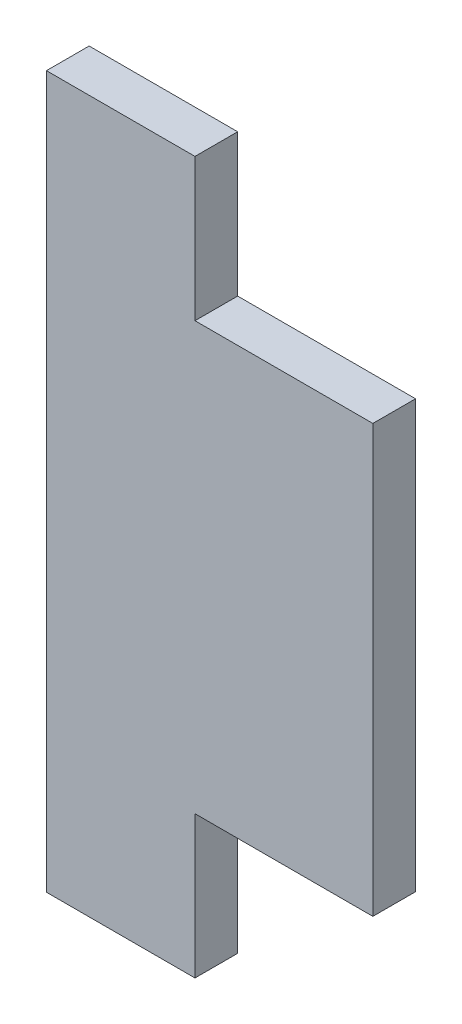
ISO-10303-21;
HEADER;
FILE_DESCRIPTION(('STEP AP214'),'2;1');
FILE_NAME('part.step','',(''),(''),'','','');
FILE_SCHEMA(('AUTOMOTIVE_DESIGN { 1 0 10303 214 1 1 1 1 }'));
ENDSEC;
DATA;
#1=APPLICATION_CONTEXT('core data for automotive mechanical design processes');
#2=APPLICATION_PROTOCOL_DEFINITION('international standard','automotive_design',2000,#1);
#3=PRODUCT_CONTEXT('',#1,'mechanical');
#4=PRODUCT('Part','Part','',(#3));
#5=PRODUCT_RELATED_PRODUCT_CATEGORY('part','',(#4));
#6=PRODUCT_DEFINITION_FORMATION('','',#4);
#7=PRODUCT_DEFINITION_CONTEXT('part definition',#1,'design');
#8=PRODUCT_DEFINITION('design','',#6,#7);
#9=PRODUCT_DEFINITION_SHAPE('','',#8);
#10=(LENGTH_UNIT() NAMED_UNIT(*) SI_UNIT(.MILLI.,.METRE.));
#11=(NAMED_UNIT(*) PLANE_ANGLE_UNIT() SI_UNIT($,.RADIAN.));
#12=(NAMED_UNIT(*) SI_UNIT($,.STERADIAN.) SOLID_ANGLE_UNIT());
#13=UNCERTAINTY_MEASURE_WITH_UNIT(LENGTH_MEASURE(1.E-05),#10,'distance_accuracy_value','');
#14=(GEOMETRIC_REPRESENTATION_CONTEXT(3) GLOBAL_UNCERTAINTY_ASSIGNED_CONTEXT((#13)) GLOBAL_UNIT_ASSIGNED_CONTEXT((#10,
#11,#12)) REPRESENTATION_CONTEXT('',''));
#15=CARTESIAN_POINT('',(0.,0.,0.));
#16=DIRECTION('',(0.,0.,1.));
#17=DIRECTION('',(1.,0.,0.));
#18=AXIS2_PLACEMENT_3D('',#15,#16,#17);
#19=CARTESIAN_POINT('',(0.104365376,-0.25,-0.03));
#20=DIRECTION('',(0.,0.,-1.));
#21=DIRECTION('',(-1.,0.,0.));
#22=AXIS2_PLACEMENT_3D('',#19,#20,#21);
#23=PLANE('',#22);
#24=DIRECTION('',(0.,1.,0.));
#25=VECTOR('',#24,1.);
#26=CARTESIAN_POINT('',(-0.020634624,-0.15,-0.03));
#27=LINE('',#26,#25);
#28=CARTESIAN_POINT('',(-0.020634624036825,-0.15,-0.03));
#29=VERTEX_POINT('',#28);
#30=CARTESIAN_POINT('',(-0.02063462402455,-0.25,-0.03));
#31=VERTEX_POINT('',#30);
#32=EDGE_CURVE('E110',#29,#31,#27,.F.);
#33=ORIENTED_EDGE('',*,*,#32,.T.);
#34=DIRECTION('',(1.,0.,0.));
#35=VECTOR('',#34,1.);
#36=CARTESIAN_POINT('',(-0.125,-0.25,-0.03));
#37=LINE('',#36,#35);
#38=CARTESIAN_POINT('',(-0.125,-0.25,-0.03));
#39=VERTEX_POINT('',#38);
#40=EDGE_CURVE('E115',#31,#39,#37,.F.);
#41=ORIENTED_EDGE('',*,*,#40,.T.);
#42=DIRECTION('',(0.,1.,0.));
#43=VECTOR('',#42,1.);
#44=CARTESIAN_POINT('',(-0.125,-0.25,-0.03));
#45=LINE('',#44,#43);
#46=CARTESIAN_POINT('',(-0.125,0.25,-0.03));
#47=VERTEX_POINT('',#46);
#48=EDGE_CURVE('E120',#39,#47,#45,.T.);
#49=ORIENTED_EDGE('',*,*,#48,.T.);
#50=DIRECTION('',(1.,0.,0.));
#51=VECTOR('',#50,1.);
#52=CARTESIAN_POINT('',(-0.125,0.25,-0.03));
#53=LINE('',#52,#51);
#54=CARTESIAN_POINT('',(-0.020634624036825,0.25,-0.03));
#55=VERTEX_POINT('',#54);
#56=EDGE_CURVE('E82',#47,#55,#53,.T.);
#57=ORIENTED_EDGE('',*,*,#56,.T.);
#58=DIRECTION('',(0.,1.,0.));
#59=VECTOR('',#58,1.);
#60=CARTESIAN_POINT('',(-0.020634624,0.25,-0.03));
#61=LINE('',#60,#59);
#62=CARTESIAN_POINT('',(-0.02063462402455,0.15,-0.03));
#63=VERTEX_POINT('',#62);
#64=EDGE_CURVE('E20',#55,#63,#61,.F.);
#65=ORIENTED_EDGE('',*,*,#64,.T.);
#66=DIRECTION('',(1.,0.,0.));
#67=VECTOR('',#66,1.);
#68=CARTESIAN_POINT('',(-0.020634624,0.15,-0.03));
#69=LINE('',#68,#67);
#70=CARTESIAN_POINT('',(0.104365376,0.15,-0.03));
#71=VERTEX_POINT('',#70);
#72=EDGE_CURVE('E79',#63,#71,#69,.T.);
#73=ORIENTED_EDGE('',*,*,#72,.T.);
#74=DIRECTION('',(0.,1.,0.));
#75=VECTOR('',#74,1.);
#76=CARTESIAN_POINT('',(0.104365376,0.15,-0.03));
#77=LINE('',#76,#75);
#78=CARTESIAN_POINT('',(0.104365376,-0.15,-0.03));
#79=VERTEX_POINT('',#78);
#80=EDGE_CURVE('E100',#71,#79,#77,.F.);
#81=ORIENTED_EDGE('',*,*,#80,.T.);
#82=DIRECTION('',(1.,0.,0.));
#83=VECTOR('',#82,1.);
#84=CARTESIAN_POINT('',(-0.020634624,-0.15,-0.03));
#85=LINE('',#84,#83);
#86=EDGE_CURVE('E105',#79,#29,#85,.F.);
#87=ORIENTED_EDGE('',*,*,#86,.T.);
#88=EDGE_LOOP('',(#33,#41,#49,#57,#65,#73,#81,#87));
#89=FACE_BOUND('',#88,.T.);
#90=ADVANCED_FACE('F17',(#89),#23,.T.);
#91=CARTESIAN_POINT('',(-0.020634624,0.25,-0.03));
#92=DIRECTION('',(-1.,0.,0.));
#93=DIRECTION('',(0.,0.,1.));
#94=AXIS2_PLACEMENT_3D('',#91,#92,#93);
#95=PLANE('',#94);
#96=ORIENTED_EDGE('',*,*,#64,.F.);
#97=DIRECTION('',(0.,0.,-1.));
#98=VECTOR('',#97,1.);
#99=CARTESIAN_POINT('',(-0.0206346240491,0.25,0.));
#100=LINE('',#99,#98);
#101=CARTESIAN_POINT('',(-0.02063462402455,0.25,0.));
#102=VERTEX_POINT('',#101);
#103=EDGE_CURVE('E124',#55,#102,#100,.F.);
#104=ORIENTED_EDGE('',*,*,#103,.T.);
#105=DIRECTION('',(0.,1.,0.));
#106=VECTOR('',#105,1.);
#107=CARTESIAN_POINT('',(-0.0206346240491,-0.25,0.));
#108=LINE('',#107,#106);
#109=CARTESIAN_POINT('',(-0.02063462402455,0.15,0.));
#110=VERTEX_POINT('',#109);
#111=EDGE_CURVE('E97',#102,#110,#108,.F.);
#112=ORIENTED_EDGE('',*,*,#111,.T.);
#113=DIRECTION('',(0.,0.,-1.));
#114=VECTOR('',#113,1.);
#115=CARTESIAN_POINT('',(-0.0206346240491,0.15,0.));
#116=LINE('',#115,#114);
#117=EDGE_CURVE('E87',#110,#63,#116,.T.);
#118=ORIENTED_EDGE('',*,*,#117,.T.);
#119=EDGE_LOOP('',(#96,#104,#112,#118));
#120=FACE_BOUND('',#119,.T.);
#121=ADVANCED_FACE('F96',(#120),#95,.F.);
#122=CARTESIAN_POINT('',(-0.020634624,0.15,0.));
#123=DIRECTION('',(0.,-1.,0.));
#124=DIRECTION('',(0.,0.,-1.));
#125=AXIS2_PLACEMENT_3D('',#122,#123,#124);
#126=PLANE('',#125);
#127=ORIENTED_EDGE('',*,*,#72,.F.);
#128=ORIENTED_EDGE('',*,*,#117,.F.);
#129=DIRECTION('',(-1.,0.,0.));
#130=VECTOR('',#129,1.);
#131=CARTESIAN_POINT('',(0.104365376,0.15,0.));
#132=LINE('',#131,#130);
#133=CARTESIAN_POINT('',(0.104365376,0.15,0.));
#134=VERTEX_POINT('',#133);
#135=EDGE_CURVE('E127',#110,#134,#132,.F.);
#136=ORIENTED_EDGE('',*,*,#135,.T.);
#137=DIRECTION('',(0.,0.,1.));
#138=VECTOR('',#137,1.);
#139=CARTESIAN_POINT('',(0.104365376,0.15,-0.03));
#140=LINE('',#139,#138);
#141=EDGE_CURVE('E93',#134,#71,#140,.F.);
#142=ORIENTED_EDGE('',*,*,#141,.T.);
#143=EDGE_LOOP('',(#127,#128,#136,#142));
#144=FACE_BOUND('',#143,.T.);
#145=ADVANCED_FACE('F90',(#144),#126,.F.);
#146=CARTESIAN_POINT('',(0.104365376,0.15,-0.03));
#147=DIRECTION('',(-1.,0.,0.));
#148=DIRECTION('',(0.,0.,1.));
#149=AXIS2_PLACEMENT_3D('',#146,#147,#148);
#150=PLANE('',#149);
#151=ORIENTED_EDGE('',*,*,#80,.F.);
#152=ORIENTED_EDGE('',*,*,#141,.F.);
#153=DIRECTION('',(0.,1.,0.));
#154=VECTOR('',#153,1.);
#155=CARTESIAN_POINT('',(0.104365376,-0.25,0.));
#156=LINE('',#155,#154);
#157=CARTESIAN_POINT('',(0.104365376,-0.15,0.));
#158=VERTEX_POINT('',#157);
#159=EDGE_CURVE('E129',#134,#158,#156,.F.);
#160=ORIENTED_EDGE('',*,*,#159,.T.);
#161=DIRECTION('',(0.,0.,1.));
#162=VECTOR('',#161,1.);
#163=CARTESIAN_POINT('',(0.104365376,-0.15,-0.03));
#164=LINE('',#163,#162);
#165=EDGE_CURVE('E102',#158,#79,#164,.F.);
#166=ORIENTED_EDGE('',*,*,#165,.T.);
#167=EDGE_LOOP('',(#151,#152,#160,#166));
#168=FACE_BOUND('',#167,.T.);
#169=ADVANCED_FACE('F162',(#168),#150,.F.);
#170=CARTESIAN_POINT('',(-0.020634624,-0.15,-0.03));
#171=DIRECTION('',(0.,1.,0.));
#172=DIRECTION('',(0.,0.,1.));
#173=AXIS2_PLACEMENT_3D('',#170,#171,#172);
#174=PLANE('',#173);
#175=ORIENTED_EDGE('',*,*,#86,.F.);
#176=ORIENTED_EDGE('',*,*,#165,.F.);
#177=DIRECTION('',(-1.,0.,0.));
#178=VECTOR('',#177,1.);
#179=CARTESIAN_POINT('',(0.104365376,-0.15,0.));
#180=LINE('',#179,#178);
#181=CARTESIAN_POINT('',(-0.020634624036825,-0.15,0.));
#182=VERTEX_POINT('',#181);
#183=EDGE_CURVE('E132',#158,#182,#180,.T.);
#184=ORIENTED_EDGE('',*,*,#183,.T.);
#185=DIRECTION('',(0.,0.,1.));
#186=VECTOR('',#185,1.);
#187=CARTESIAN_POINT('',(-0.020634624,-0.15,-0.03));
#188=LINE('',#187,#186);
#189=EDGE_CURVE('E107',#182,#29,#188,.F.);
#190=ORIENTED_EDGE('',*,*,#189,.T.);
#191=EDGE_LOOP('',(#175,#176,#184,#190));
#192=FACE_BOUND('',#191,.T.);
#193=ADVANCED_FACE('F160',(#192),#174,.F.);
#194=CARTESIAN_POINT('',(-0.020634624,-0.15,-0.03));
#195=DIRECTION('',(-1.,0.,0.));
#196=DIRECTION('',(0.,0.,1.));
#197=AXIS2_PLACEMENT_3D('',#194,#195,#196);
#198=PLANE('',#197);
#199=ORIENTED_EDGE('',*,*,#32,.F.);
#200=ORIENTED_EDGE('',*,*,#189,.F.);
#201=DIRECTION('',(0.,1.,0.));
#202=VECTOR('',#201,1.);
#203=CARTESIAN_POINT('',(-0.0206346240491,-0.25,0.));
#204=LINE('',#203,#202);
#205=CARTESIAN_POINT('',(-0.02063462402455,-0.25,0.));
#206=VERTEX_POINT('',#205);
#207=EDGE_CURVE('E135',#182,#206,#204,.F.);
#208=ORIENTED_EDGE('',*,*,#207,.T.);
#209=DIRECTION('',(0.,0.,1.));
#210=VECTOR('',#209,1.);
#211=CARTESIAN_POINT('',(-0.0206346240491,-0.25,-0.03));
#212=LINE('',#211,#210);
#213=EDGE_CURVE('E112',#206,#31,#212,.F.);
#214=ORIENTED_EDGE('',*,*,#213,.T.);
#215=EDGE_LOOP('',(#199,#200,#208,#214));
#216=FACE_BOUND('',#215,.T.);
#217=ADVANCED_FACE('F155',(#216),#198,.F.);
#218=CARTESIAN_POINT('',(-0.125,-0.25,-0.03));
#219=DIRECTION('',(0.,1.,0.));
#220=DIRECTION('',(0.,0.,1.));
#221=AXIS2_PLACEMENT_3D('',#218,#219,#220);
#222=PLANE('',#221);
#223=ORIENTED_EDGE('',*,*,#40,.F.);
#224=ORIENTED_EDGE('',*,*,#213,.F.);
#225=DIRECTION('',(-1.,0.,0.));
#226=VECTOR('',#225,1.);
#227=CARTESIAN_POINT('',(0.104365376,-0.25,0.));
#228=LINE('',#227,#226);
#229=CARTESIAN_POINT('',(-0.125,-0.25,0.));
#230=VERTEX_POINT('',#229);
#231=EDGE_CURVE('E138',#206,#230,#228,.T.);
#232=ORIENTED_EDGE('',*,*,#231,.T.);
#233=DIRECTION('',(0.,0.,-1.));
#234=VECTOR('',#233,1.);
#235=CARTESIAN_POINT('',(-0.125,-0.25,-0.03));
#236=LINE('',#235,#234);
#237=EDGE_CURVE('E117',#230,#39,#236,.T.);
#238=ORIENTED_EDGE('',*,*,#237,.T.);
#239=EDGE_LOOP('',(#223,#224,#232,#238));
#240=FACE_BOUND('',#239,.T.);
#241=ADVANCED_FACE('F152',(#240),#222,.F.);
#242=CARTESIAN_POINT('',(-0.125,-0.25,-0.03));
#243=DIRECTION('',(1.,0.,0.));
#244=DIRECTION('',(0.,0.,-1.));
#245=AXIS2_PLACEMENT_3D('',#242,#243,#244);
#246=PLANE('',#245);
#247=ORIENTED_EDGE('',*,*,#48,.F.);
#248=ORIENTED_EDGE('',*,*,#237,.F.);
#249=DIRECTION('',(0.,1.,0.));
#250=VECTOR('',#249,1.);
#251=CARTESIAN_POINT('',(-0.125,-0.25,0.));
#252=LINE('',#251,#250);
#253=CARTESIAN_POINT('',(-0.125,0.25,0.));
#254=VERTEX_POINT('',#253);
#255=EDGE_CURVE('E26',#230,#254,#252,.T.);
#256=ORIENTED_EDGE('',*,*,#255,.T.);
#257=DIRECTION('',(0.,0.,-1.));
#258=VECTOR('',#257,1.);
#259=CARTESIAN_POINT('',(-0.125,0.25,0.));
#260=LINE('',#259,#258);
#261=EDGE_CURVE('E34',#254,#47,#260,.T.);
#262=ORIENTED_EDGE('',*,*,#261,.T.);
#263=EDGE_LOOP('',(#247,#248,#256,#262));
#264=FACE_BOUND('',#263,.T.);
#265=ADVANCED_FACE('F145',(#264),#246,.F.);
#266=CARTESIAN_POINT('',(-0.125,0.25,0.));
#267=DIRECTION('',(0.,-1.,0.));
#268=DIRECTION('',(0.,0.,-1.));
#269=AXIS2_PLACEMENT_3D('',#266,#267,#268);
#270=PLANE('',#269);
#271=ORIENTED_EDGE('',*,*,#56,.F.);
#272=ORIENTED_EDGE('',*,*,#261,.F.);
#273=DIRECTION('',(-1.,0.,0.));
#274=VECTOR('',#273,1.);
#275=CARTESIAN_POINT('',(0.104365376,0.25,0.));
#276=LINE('',#275,#274);
#277=EDGE_CURVE('E11',#254,#102,#276,.F.);
#278=ORIENTED_EDGE('',*,*,#277,.T.);
#279=ORIENTED_EDGE('',*,*,#103,.F.);
#280=EDGE_LOOP('',(#271,#272,#278,#279));
#281=FACE_BOUND('',#280,.T.);
#282=ADVANCED_FACE('F163',(#281),#270,.F.);
#283=CARTESIAN_POINT('',(0.104365376,-0.25,0.));
#284=DIRECTION('',(0.,0.,-1.));
#285=DIRECTION('',(-1.,0.,0.));
#286=AXIS2_PLACEMENT_3D('',#283,#284,#285);
#287=PLANE('',#286);
#288=ORIENTED_EDGE('',*,*,#255,.F.);
#289=ORIENTED_EDGE('',*,*,#231,.F.);
#290=ORIENTED_EDGE('',*,*,#207,.F.);
#291=ORIENTED_EDGE('',*,*,#183,.F.);
#292=ORIENTED_EDGE('',*,*,#159,.F.);
#293=ORIENTED_EDGE('',*,*,#135,.F.);
#294=ORIENTED_EDGE('',*,*,#111,.F.);
#295=ORIENTED_EDGE('',*,*,#277,.F.);
#296=EDGE_LOOP('',(#288,#289,#290,#291,#292,#293,#294,#295));
#297=FACE_BOUND('',#296,.T.);
#298=ADVANCED_FACE('F148',(#297),#287,.F.);
#299=CLOSED_SHELL('',(#90,#121,#145,#169,#193,#217,#241,#265,#282,#298));
#300=MANIFOLD_SOLID_BREP('B1',#299);
#301=ADVANCED_BREP_SHAPE_REPRESENTATION('',(#18,#300),#14);
#302=SHAPE_DEFINITION_REPRESENTATION(#9,#301);
ENDSEC;
END-ISO-10303-21;
